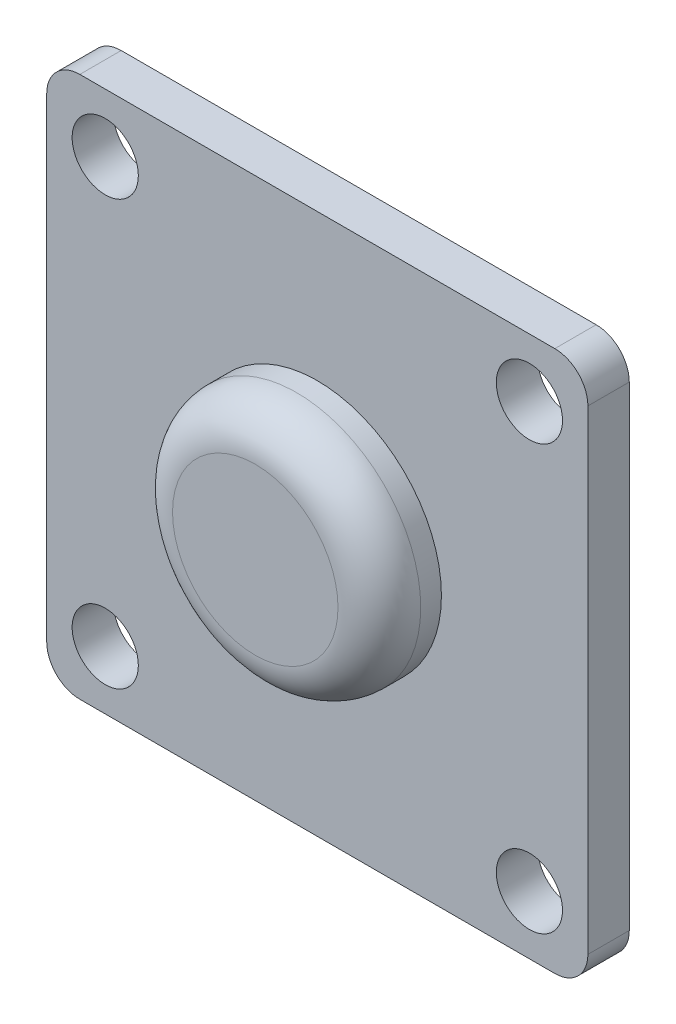
ISO-10303-21;
HEADER;
FILE_DESCRIPTION(('STEP AP214'),'2;1');
FILE_NAME('part.step','',(''),(''),'','','');
FILE_SCHEMA(('AUTOMOTIVE_DESIGN { 1 0 10303 214 1 1 1 1 }'));
ENDSEC;
DATA;
#1=APPLICATION_CONTEXT('core data for automotive mechanical design processes');
#2=APPLICATION_PROTOCOL_DEFINITION('international standard','automotive_design',2000,#1);
#3=PRODUCT_CONTEXT('',#1,'mechanical');
#4=PRODUCT('Part','Part','',(#3));
#5=PRODUCT_RELATED_PRODUCT_CATEGORY('part','',(#4));
#6=PRODUCT_DEFINITION_FORMATION('','',#4);
#7=PRODUCT_DEFINITION_CONTEXT('part definition',#1,'design');
#8=PRODUCT_DEFINITION('design','',#6,#7);
#9=PRODUCT_DEFINITION_SHAPE('','',#8);
#10=(LENGTH_UNIT() NAMED_UNIT(*) SI_UNIT(.MILLI.,.METRE.));
#11=(NAMED_UNIT(*) PLANE_ANGLE_UNIT() SI_UNIT($,.RADIAN.));
#12=(NAMED_UNIT(*) SI_UNIT($,.STERADIAN.) SOLID_ANGLE_UNIT());
#13=UNCERTAINTY_MEASURE_WITH_UNIT(LENGTH_MEASURE(1.E-05),#10,'distance_accuracy_value','');
#14=(GEOMETRIC_REPRESENTATION_CONTEXT(3) GLOBAL_UNCERTAINTY_ASSIGNED_CONTEXT((#13)) GLOBAL_UNIT_ASSIGNED_CONTEXT((#10,
#11,#12)) REPRESENTATION_CONTEXT('',''));
#15=CARTESIAN_POINT('',(0.,0.,0.));
#16=DIRECTION('',(0.,0.,1.));
#17=DIRECTION('',(1.,0.,0.));
#18=AXIS2_PLACEMENT_3D('',#15,#16,#17);
#19=CARTESIAN_POINT('',(0.,0.,2.));
#20=DIRECTION('',(0.,0.,-1.));
#21=DIRECTION('',(-1.,0.,0.));
#22=AXIS2_PLACEMENT_3D('',#19,#20,#21);
#23=PLANE('',#22);
#24=CARTESIAN_POINT('',(0.,0.,2.));
#25=DIRECTION('',(0.,0.,1.));
#26=DIRECTION('',(1.,0.,0.));
#27=AXIS2_PLACEMENT_3D('',#24,#25,#26);
#28=CIRCLE('',#27,6.);
#29=CARTESIAN_POINT('',(6.,0.,2.));
#30=VERTEX_POINT('',#29);
#31=EDGE_CURVE('E156',#30,#30,#28,.T.);
#32=ORIENTED_EDGE('',*,*,#31,.F.);
#33=EDGE_LOOP('',(#32));
#34=FACE_BOUND('',#33,.T.);
#35=DIRECTION('',(-1.,0.,0.));
#36=VECTOR('',#35,1.);
#37=CARTESIAN_POINT('',(-13.0814754519511,13.0814754519512,2.));
#38=LINE('',#37,#36);
#39=CARTESIAN_POINT('',(11.4814754519511,13.0814754519512,2.));
#40=VERTEX_POINT('',#39);
#41=CARTESIAN_POINT('',(-11.4814754519511,13.0814754519512,2.));
#42=VERTEX_POINT('',#41);
#43=EDGE_CURVE('E210',#40,#42,#38,.T.);
#44=ORIENTED_EDGE('',*,*,#43,.T.);
#45=CARTESIAN_POINT('',(-11.4814754519511,11.4814754519511,2.));
#46=DIRECTION('',(0.,0.,-1.));
#47=DIRECTION('',(-1.,0.,0.));
#48=AXIS2_PLACEMENT_3D('',#45,#46,#47);
#49=CIRCLE('',#48,1.6);
#50=CARTESIAN_POINT('',(-13.0814754519511,11.4814754519511,2.));
#51=VERTEX_POINT('',#50);
#52=EDGE_CURVE('E182',#42,#51,#49,.F.);
#53=ORIENTED_EDGE('',*,*,#52,.T.);
#54=DIRECTION('',(0.,-1.,0.));
#55=VECTOR('',#54,1.);
#56=CARTESIAN_POINT('',(-13.0814754519511,-13.0814754519512,2.));
#57=LINE('',#56,#55);
#58=CARTESIAN_POINT('',(-13.0814754519511,-11.4814754519512,2.));
#59=VERTEX_POINT('',#58);
#60=EDGE_CURVE('E131',#51,#59,#57,.T.);
#61=ORIENTED_EDGE('',*,*,#60,.T.);
#62=CARTESIAN_POINT('',(-11.4814754519511,-11.4814754519512,2.));
#63=DIRECTION('',(0.,0.,-1.));
#64=DIRECTION('',(-1.,0.,0.));
#65=AXIS2_PLACEMENT_3D('',#62,#63,#64);
#66=CIRCLE('',#65,1.6);
#67=CARTESIAN_POINT('',(-11.4814754519511,-13.0814754519512,2.));
#68=VERTEX_POINT('',#67);
#69=EDGE_CURVE('E66',#59,#68,#66,.F.);
#70=ORIENTED_EDGE('',*,*,#69,.T.);
#71=DIRECTION('',(1.,0.,0.));
#72=VECTOR('',#71,1.);
#73=CARTESIAN_POINT('',(-13.0814754519511,-13.0814754519512,2.));
#74=LINE('',#73,#72);
#75=CARTESIAN_POINT('',(11.4814754519511,-13.0814754519512,2.));
#76=VERTEX_POINT('',#75);
#77=EDGE_CURVE('E195',#68,#76,#74,.T.);
#78=ORIENTED_EDGE('',*,*,#77,.T.);
#79=CARTESIAN_POINT('',(11.4814754519511,-11.4814754519512,2.));
#80=DIRECTION('',(0.,0.,-1.));
#81=DIRECTION('',(-1.,0.,0.));
#82=AXIS2_PLACEMENT_3D('',#79,#80,#81);
#83=CIRCLE('',#82,1.6);
#84=CARTESIAN_POINT('',(13.0814754519511,-11.4814754519512,2.));
#85=VERTEX_POINT('',#84);
#86=EDGE_CURVE('E176',#76,#85,#83,.F.);
#87=ORIENTED_EDGE('',*,*,#86,.T.);
#88=DIRECTION('',(0.,1.,0.));
#89=VECTOR('',#88,1.);
#90=CARTESIAN_POINT('',(13.0814754519511,-13.0814754519512,2.));
#91=LINE('',#90,#89);
#92=CARTESIAN_POINT('',(13.0814754519511,11.4814754519511,2.));
#93=VERTEX_POINT('',#92);
#94=EDGE_CURVE('E145',#85,#93,#91,.T.);
#95=ORIENTED_EDGE('',*,*,#94,.T.);
#96=CARTESIAN_POINT('',(11.4814754519511,11.4814754519511,2.));
#97=DIRECTION('',(0.,0.,-1.));
#98=DIRECTION('',(-1.,0.,0.));
#99=AXIS2_PLACEMENT_3D('',#96,#97,#98);
#100=CIRCLE('',#99,1.6);
#101=EDGE_CURVE('E179',#93,#40,#100,.F.);
#102=ORIENTED_EDGE('',*,*,#101,.T.);
#103=EDGE_LOOP('',(#44,#53,#61,#70,#78,#87,#95,#102));
#104=FACE_BOUND('',#103,.T.);
#105=CARTESIAN_POINT('',(10.253048327205,10.2530483272049,2.));
#106=DIRECTION('',(0.,0.,1.));
#107=DIRECTION('',(1.,0.,0.));
#108=AXIS2_PLACEMENT_3D('',#105,#106,#107);
#109=CIRCLE('',#108,1.6);
#110=CARTESIAN_POINT('',(11.853048327205,10.2530483272049,2.));
#111=VERTEX_POINT('',#110);
#112=EDGE_CURVE('E223',#111,#111,#109,.T.);
#113=ORIENTED_EDGE('',*,*,#112,.F.);
#114=EDGE_LOOP('',(#113));
#115=FACE_BOUND('',#114,.T.);
#116=CARTESIAN_POINT('',(-10.2530483272049,10.2530483272049,2.));
#117=DIRECTION('',(0.,0.,1.));
#118=DIRECTION('',(1.,0.,0.));
#119=AXIS2_PLACEMENT_3D('',#116,#117,#118);
#120=CIRCLE('',#119,1.6);
#121=CARTESIAN_POINT('',(-8.65304832720488,10.2530483272049,2.));
#122=VERTEX_POINT('',#121);
#123=EDGE_CURVE('E230',#122,#122,#120,.T.);
#124=ORIENTED_EDGE('',*,*,#123,.F.);
#125=EDGE_LOOP('',(#124));
#126=FACE_BOUND('',#125,.T.);
#127=CARTESIAN_POINT('',(-10.2530483272049,-10.253048327205,2.));
#128=DIRECTION('',(0.,0.,1.));
#129=DIRECTION('',(1.,0.,0.));
#130=AXIS2_PLACEMENT_3D('',#127,#128,#129);
#131=CIRCLE('',#130,1.6);
#132=CARTESIAN_POINT('',(-8.65304832720488,-10.253048327205,2.));
#133=VERTEX_POINT('',#132);
#134=EDGE_CURVE('E236',#133,#133,#131,.T.);
#135=ORIENTED_EDGE('',*,*,#134,.F.);
#136=EDGE_LOOP('',(#135));
#137=FACE_BOUND('',#136,.T.);
#138=CARTESIAN_POINT('',(10.253048327205,-10.253048327205,2.));
#139=DIRECTION('',(0.,0.,1.));
#140=DIRECTION('',(1.,0.,0.));
#141=AXIS2_PLACEMENT_3D('',#138,#139,#140);
#142=CIRCLE('',#141,1.6);
#143=CARTESIAN_POINT('',(11.853048327205,-10.253048327205,2.));
#144=VERTEX_POINT('',#143);
#145=EDGE_CURVE('E244',#144,#144,#142,.T.);
#146=ORIENTED_EDGE('',*,*,#145,.F.);
#147=EDGE_LOOP('',(#146));
#148=FACE_BOUND('',#147,.T.);
#149=ADVANCED_FACE('F45',(#34,#104,#115,#126,#137,#148),#23,.F.);
#150=CARTESIAN_POINT('',(0.,0.,0.));
#151=DIRECTION('',(0.,0.,-1.));
#152=DIRECTION('',(-1.,0.,0.));
#153=AXIS2_PLACEMENT_3D('',#150,#151,#152);
#154=PLANE('',#153);
#155=CARTESIAN_POINT('',(0.,0.,0.));
#156=DIRECTION('',(0.,0.,-1.));
#157=DIRECTION('',(-1.,0.,0.));
#158=AXIS2_PLACEMENT_3D('',#155,#156,#157);
#159=CIRCLE('',#158,3.1);
#160=CARTESIAN_POINT('',(-3.1,0.,0.));
#161=VERTEX_POINT('',#160);
#162=EDGE_CURVE('E259',#161,#161,#159,.T.);
#163=ORIENTED_EDGE('',*,*,#162,.F.);
#164=EDGE_LOOP('',(#163));
#165=FACE_BOUND('',#164,.T.);
#166=CARTESIAN_POINT('',(-10.2530483272049,-10.253048327205,0.));
#167=DIRECTION('',(0.,0.,1.));
#168=DIRECTION('',(1.,0.,0.));
#169=AXIS2_PLACEMENT_3D('',#166,#167,#168);
#170=CIRCLE('',#169,1.6);
#171=CARTESIAN_POINT('',(-8.65304832720488,-10.253048327205,0.));
#172=VERTEX_POINT('',#171);
#173=EDGE_CURVE('E240',#172,#172,#170,.T.);
#174=ORIENTED_EDGE('',*,*,#173,.T.);
#175=EDGE_LOOP('',(#174));
#176=FACE_BOUND('',#175,.T.);
#177=CARTESIAN_POINT('',(10.253048327205,10.2530483272049,0.));
#178=DIRECTION('',(0.,0.,1.));
#179=DIRECTION('',(1.,0.,0.));
#180=AXIS2_PLACEMENT_3D('',#177,#178,#179);
#181=CIRCLE('',#180,1.6);
#182=CARTESIAN_POINT('',(11.853048327205,10.2530483272049,0.));
#183=VERTEX_POINT('',#182);
#184=EDGE_CURVE('E216',#183,#183,#181,.T.);
#185=ORIENTED_EDGE('',*,*,#184,.T.);
#186=EDGE_LOOP('',(#185));
#187=FACE_BOUND('',#186,.T.);
#188=DIRECTION('',(0.,-1.,0.));
#189=VECTOR('',#188,1.);
#190=CARTESIAN_POINT('',(-13.0814754519511,-13.0814754519512,0.));
#191=LINE('',#190,#189);
#192=CARTESIAN_POINT('',(-13.0814754519511,11.4814754519511,0.));
#193=VERTEX_POINT('',#192);
#194=CARTESIAN_POINT('',(-13.0814754519511,-11.4814754519512,0.));
#195=VERTEX_POINT('',#194);
#196=EDGE_CURVE('E129',#193,#195,#191,.T.);
#197=ORIENTED_EDGE('',*,*,#196,.F.);
#198=CARTESIAN_POINT('',(-11.4814754519511,11.4814754519511,0.));
#199=DIRECTION('',(0.,0.,-1.));
#200=DIRECTION('',(-1.,0.,0.));
#201=AXIS2_PLACEMENT_3D('',#198,#199,#200);
#202=CIRCLE('',#201,1.6);
#203=CARTESIAN_POINT('',(-11.4814754519511,13.0814754519512,0.));
#204=VERTEX_POINT('',#203);
#205=EDGE_CURVE('E111',#193,#204,#202,.T.);
#206=ORIENTED_EDGE('',*,*,#205,.T.);
#207=DIRECTION('',(-1.,0.,0.));
#208=VECTOR('',#207,1.);
#209=CARTESIAN_POINT('',(-13.0814754519511,13.0814754519512,0.));
#210=LINE('',#209,#208);
#211=CARTESIAN_POINT('',(11.4814754519511,13.0814754519512,0.));
#212=VERTEX_POINT('',#211);
#213=EDGE_CURVE('E141',#212,#204,#210,.T.);
#214=ORIENTED_EDGE('',*,*,#213,.F.);
#215=CARTESIAN_POINT('',(11.4814754519511,11.4814754519511,0.));
#216=DIRECTION('',(0.,0.,-1.));
#217=DIRECTION('',(-1.,0.,0.));
#218=AXIS2_PLACEMENT_3D('',#215,#216,#217);
#219=CIRCLE('',#218,1.6);
#220=CARTESIAN_POINT('',(13.0814754519511,11.4814754519511,0.));
#221=VERTEX_POINT('',#220);
#222=EDGE_CURVE('E123',#212,#221,#219,.T.);
#223=ORIENTED_EDGE('',*,*,#222,.T.);
#224=DIRECTION('',(0.,1.,0.));
#225=VECTOR('',#224,1.);
#226=CARTESIAN_POINT('',(13.0814754519511,-13.0814754519512,0.));
#227=LINE('',#226,#225);
#228=CARTESIAN_POINT('',(13.0814754519511,-11.4814754519512,0.));
#229=VERTEX_POINT('',#228);
#230=EDGE_CURVE('E147',#229,#221,#227,.T.);
#231=ORIENTED_EDGE('',*,*,#230,.F.);
#232=CARTESIAN_POINT('',(11.4814754519511,-11.4814754519512,0.));
#233=DIRECTION('',(0.,0.,-1.));
#234=DIRECTION('',(-1.,0.,0.));
#235=AXIS2_PLACEMENT_3D('',#232,#233,#234);
#236=CIRCLE('',#235,1.6);
#237=CARTESIAN_POINT('',(11.4814754519511,-13.0814754519512,0.));
#238=VERTEX_POINT('',#237);
#239=EDGE_CURVE('E164',#229,#238,#236,.T.);
#240=ORIENTED_EDGE('',*,*,#239,.T.);
#241=DIRECTION('',(1.,0.,0.));
#242=VECTOR('',#241,1.);
#243=CARTESIAN_POINT('',(-13.0814754519511,-13.0814754519512,0.));
#244=LINE('',#243,#242);
#245=CARTESIAN_POINT('',(-11.4814754519511,-13.0814754519512,0.));
#246=VERTEX_POINT('',#245);
#247=EDGE_CURVE('E140',#246,#238,#244,.T.);
#248=ORIENTED_EDGE('',*,*,#247,.F.);
#249=CARTESIAN_POINT('',(-11.4814754519511,-11.4814754519512,0.));
#250=DIRECTION('',(0.,0.,-1.));
#251=DIRECTION('',(-1.,0.,0.));
#252=AXIS2_PLACEMENT_3D('',#249,#250,#251);
#253=CIRCLE('',#252,1.6);
#254=EDGE_CURVE('E133',#246,#195,#253,.T.);
#255=ORIENTED_EDGE('',*,*,#254,.T.);
#256=EDGE_LOOP('',(#197,#206,#214,#223,#231,#240,#248,#255));
#257=FACE_BOUND('',#256,.T.);
#258=CARTESIAN_POINT('',(-10.2530483272049,10.2530483272049,0.));
#259=DIRECTION('',(0.,0.,1.));
#260=DIRECTION('',(1.,0.,0.));
#261=AXIS2_PLACEMENT_3D('',#258,#259,#260);
#262=CIRCLE('',#261,1.6);
#263=CARTESIAN_POINT('',(-8.65304832720488,10.2530483272049,0.));
#264=VERTEX_POINT('',#263);
#265=EDGE_CURVE('E232',#264,#264,#262,.T.);
#266=ORIENTED_EDGE('',*,*,#265,.T.);
#267=EDGE_LOOP('',(#266));
#268=FACE_BOUND('',#267,.T.);
#269=CARTESIAN_POINT('',(10.253048327205,-10.253048327205,0.));
#270=DIRECTION('',(0.,0.,1.));
#271=DIRECTION('',(1.,0.,0.));
#272=AXIS2_PLACEMENT_3D('',#269,#270,#271);
#273=CIRCLE('',#272,1.6);
#274=CARTESIAN_POINT('',(11.853048327205,-10.253048327205,0.));
#275=VERTEX_POINT('',#274);
#276=EDGE_CURVE('E248',#275,#275,#273,.T.);
#277=ORIENTED_EDGE('',*,*,#276,.T.);
#278=EDGE_LOOP('',(#277));
#279=FACE_BOUND('',#278,.T.);
#280=ADVANCED_FACE('F136',(#165,#176,#187,#257,#268,#279),#154,.T.);
#281=CARTESIAN_POINT('',(13.0814754519511,-13.0814754519512,2.));
#282=DIRECTION('',(-1.,0.,0.));
#283=DIRECTION('',(0.,0.,1.));
#284=AXIS2_PLACEMENT_3D('',#281,#282,#283);
#285=PLANE('',#284);
#286=ORIENTED_EDGE('',*,*,#230,.T.);
#287=DIRECTION('',(0.,0.,-1.));
#288=VECTOR('',#287,1.);
#289=CARTESIAN_POINT('',(13.0814754519511,11.4814754519511,2.));
#290=LINE('',#289,#288);
#291=EDGE_CURVE('E189',#221,#93,#290,.F.);
#292=ORIENTED_EDGE('',*,*,#291,.T.);
#293=ORIENTED_EDGE('',*,*,#94,.F.);
#294=DIRECTION('',(0.,0.,-1.));
#295=VECTOR('',#294,1.);
#296=CARTESIAN_POINT('',(13.0814754519511,-11.4814754519512,2.));
#297=LINE('',#296,#295);
#298=EDGE_CURVE('E185',#85,#229,#297,.T.);
#299=ORIENTED_EDGE('',*,*,#298,.T.);
#300=EDGE_LOOP('',(#286,#292,#293,#299));
#301=FACE_BOUND('',#300,.T.);
#302=ADVANCED_FACE('F205',(#301),#285,.F.);
#303=CARTESIAN_POINT('',(-13.0814754519511,13.0814754519512,2.));
#304=DIRECTION('',(0.,-1.,0.));
#305=DIRECTION('',(0.,0.,-1.));
#306=AXIS2_PLACEMENT_3D('',#303,#304,#305);
#307=PLANE('',#306);
#308=ORIENTED_EDGE('',*,*,#213,.T.);
#309=DIRECTION('',(0.,0.,-1.));
#310=VECTOR('',#309,1.);
#311=CARTESIAN_POINT('',(-11.4814754519511,13.0814754519512,2.));
#312=LINE('',#311,#310);
#313=EDGE_CURVE('E116',#204,#42,#312,.F.);
#314=ORIENTED_EDGE('',*,*,#313,.T.);
#315=ORIENTED_EDGE('',*,*,#43,.F.);
#316=DIRECTION('',(0.,0.,-1.));
#317=VECTOR('',#316,1.);
#318=CARTESIAN_POINT('',(11.4814754519511,13.0814754519512,2.));
#319=LINE('',#318,#317);
#320=EDGE_CURVE('E122',#40,#212,#319,.T.);
#321=ORIENTED_EDGE('',*,*,#320,.T.);
#322=EDGE_LOOP('',(#308,#314,#315,#321));
#323=FACE_BOUND('',#322,.T.);
#324=ADVANCED_FACE('F305',(#323),#307,.F.);
#325=CARTESIAN_POINT('',(-13.0814754519511,-13.0814754519512,2.));
#326=DIRECTION('',(1.,0.,0.));
#327=DIRECTION('',(0.,0.,-1.));
#328=AXIS2_PLACEMENT_3D('',#325,#326,#327);
#329=PLANE('',#328);
#330=ORIENTED_EDGE('',*,*,#60,.F.);
#331=DIRECTION('',(0.,0.,-1.));
#332=VECTOR('',#331,1.);
#333=CARTESIAN_POINT('',(-13.0814754519511,11.4814754519511,2.));
#334=LINE('',#333,#332);
#335=EDGE_CURVE('E115',#51,#193,#334,.T.);
#336=ORIENTED_EDGE('',*,*,#335,.T.);
#337=ORIENTED_EDGE('',*,*,#196,.T.);
#338=DIRECTION('',(0.,0.,-1.));
#339=VECTOR('',#338,1.);
#340=CARTESIAN_POINT('',(-13.0814754519511,-11.4814754519512,2.));
#341=LINE('',#340,#339);
#342=EDGE_CURVE('E134',#195,#59,#341,.F.);
#343=ORIENTED_EDGE('',*,*,#342,.T.);
#344=EDGE_LOOP('',(#330,#336,#337,#343));
#345=FACE_BOUND('',#344,.T.);
#346=ADVANCED_FACE('F128',(#345),#329,.F.);
#347=CARTESIAN_POINT('',(-13.0814754519511,-13.0814754519512,2.));
#348=DIRECTION('',(0.,1.,0.));
#349=DIRECTION('',(0.,0.,1.));
#350=AXIS2_PLACEMENT_3D('',#347,#348,#349);
#351=PLANE('',#350);
#352=ORIENTED_EDGE('',*,*,#247,.T.);
#353=DIRECTION('',(0.,0.,-1.));
#354=VECTOR('',#353,1.);
#355=CARTESIAN_POINT('',(11.4814754519511,-13.0814754519512,2.));
#356=LINE('',#355,#354);
#357=EDGE_CURVE('E11',#238,#76,#356,.F.);
#358=ORIENTED_EDGE('',*,*,#357,.T.);
#359=ORIENTED_EDGE('',*,*,#77,.F.);
#360=DIRECTION('',(0.,0.,-1.));
#361=VECTOR('',#360,1.);
#362=CARTESIAN_POINT('',(-11.4814754519511,-13.0814754519512,2.));
#363=LINE('',#362,#361);
#364=EDGE_CURVE('E54',#68,#246,#363,.T.);
#365=ORIENTED_EDGE('',*,*,#364,.T.);
#366=EDGE_LOOP('',(#352,#358,#359,#365));
#367=FACE_BOUND('',#366,.T.);
#368=ADVANCED_FACE('F194',(#367),#351,.F.);
#369=CARTESIAN_POINT('',(10.253048327205,10.2530483272049,2.));
#370=DIRECTION('',(0.,0.,-1.));
#371=DIRECTION('',(-1.,0.,0.));
#372=AXIS2_PLACEMENT_3D('',#369,#370,#371);
#373=CYLINDRICAL_SURFACE('',#372,1.6);
#374=ORIENTED_EDGE('',*,*,#112,.T.);
#375=EDGE_LOOP('',(#374));
#376=FACE_BOUND('',#375,.T.);
#377=ORIENTED_EDGE('',*,*,#184,.F.);
#378=EDGE_LOOP('',(#377));
#379=FACE_BOUND('',#378,.T.);
#380=ADVANCED_FACE('F283',(#376,#379),#373,.F.);
#381=CARTESIAN_POINT('',(-10.2530483272049,10.2530483272049,2.));
#382=DIRECTION('',(0.,0.,-1.));
#383=DIRECTION('',(-1.,0.,0.));
#384=AXIS2_PLACEMENT_3D('',#381,#382,#383);
#385=CYLINDRICAL_SURFACE('',#384,1.6);
#386=ORIENTED_EDGE('',*,*,#123,.T.);
#387=EDGE_LOOP('',(#386));
#388=FACE_BOUND('',#387,.T.);
#389=ORIENTED_EDGE('',*,*,#265,.F.);
#390=EDGE_LOOP('',(#389));
#391=FACE_BOUND('',#390,.T.);
#392=ADVANCED_FACE('F285',(#388,#391),#385,.F.);
#393=CARTESIAN_POINT('',(-10.2530483272049,-10.253048327205,2.));
#394=DIRECTION('',(0.,0.,-1.));
#395=DIRECTION('',(-1.,0.,0.));
#396=AXIS2_PLACEMENT_3D('',#393,#394,#395);
#397=CYLINDRICAL_SURFACE('',#396,1.6);
#398=ORIENTED_EDGE('',*,*,#134,.T.);
#399=EDGE_LOOP('',(#398));
#400=FACE_BOUND('',#399,.T.);
#401=ORIENTED_EDGE('',*,*,#173,.F.);
#402=EDGE_LOOP('',(#401));
#403=FACE_BOUND('',#402,.T.);
#404=ADVANCED_FACE('F290',(#400,#403),#397,.F.);
#405=CARTESIAN_POINT('',(10.253048327205,-10.253048327205,2.));
#406=DIRECTION('',(0.,0.,-1.));
#407=DIRECTION('',(-1.,0.,0.));
#408=AXIS2_PLACEMENT_3D('',#405,#406,#407);
#409=CYLINDRICAL_SURFACE('',#408,1.6);
#410=ORIENTED_EDGE('',*,*,#145,.T.);
#411=EDGE_LOOP('',(#410));
#412=FACE_BOUND('',#411,.T.);
#413=ORIENTED_EDGE('',*,*,#276,.F.);
#414=EDGE_LOOP('',(#413));
#415=FACE_BOUND('',#414,.T.);
#416=ADVANCED_FACE('F335',(#412,#415),#409,.F.);
#417=CARTESIAN_POINT('',(0.,0.,5.));
#418=DIRECTION('',(0.,0.,-1.));
#419=DIRECTION('',(-1.,0.,0.));
#420=AXIS2_PLACEMENT_3D('',#417,#418,#419);
#421=CYLINDRICAL_SURFACE('',#420,6.);
#422=CARTESIAN_POINT('',(0.,0.,3.));
#423=DIRECTION('',(0.,0.,1.));
#424=DIRECTION('',(1.,0.,0.));
#425=AXIS2_PLACEMENT_3D('',#422,#423,#424);
#426=CIRCLE('',#425,6.);
#427=CARTESIAN_POINT('',(6.,0.,3.));
#428=VERTEX_POINT('',#427);
#429=EDGE_CURVE('E155',#428,#428,#426,.F.);
#430=ORIENTED_EDGE('',*,*,#429,.T.);
#431=EDGE_LOOP('',(#430));
#432=FACE_BOUND('',#431,.T.);
#433=ORIENTED_EDGE('',*,*,#31,.T.);
#434=EDGE_LOOP('',(#433));
#435=FACE_BOUND('',#434,.T.);
#436=ADVANCED_FACE('F338',(#432,#435),#421,.T.);
#437=CARTESIAN_POINT('',(0.,0.,5.));
#438=DIRECTION('',(0.,0.,1.));
#439=DIRECTION('',(1.,0.,0.));
#440=AXIS2_PLACEMENT_3D('',#437,#438,#439);
#441=PLANE('',#440);
#442=CARTESIAN_POINT('',(0.,0.,5.));
#443=DIRECTION('',(0.,0.,1.));
#444=DIRECTION('',(1.,0.,0.));
#445=AXIS2_PLACEMENT_3D('',#442,#443,#444);
#446=CIRCLE('',#445,4.);
#447=CARTESIAN_POINT('',(4.,0.,5.));
#448=VERTEX_POINT('',#447);
#449=EDGE_CURVE('E151',#448,#448,#446,.T.);
#450=ORIENTED_EDGE('',*,*,#449,.T.);
#451=EDGE_LOOP('',(#450));
#452=FACE_BOUND('',#451,.T.);
#453=ADVANCED_FACE('F272',(#452),#441,.T.);
#454=CARTESIAN_POINT('',(0.,0.,3.));
#455=DIRECTION('',(0.,0.,-1.));
#456=DIRECTION('',(-1.,0.,0.));
#457=AXIS2_PLACEMENT_3D('',#454,#455,#456);
#458=CYLINDRICAL_SURFACE('',#457,3.1);
#459=CARTESIAN_POINT('',(0.,0.,3.));
#460=DIRECTION('',(0.,0.,-1.));
#461=DIRECTION('',(-1.,0.,0.));
#462=AXIS2_PLACEMENT_3D('',#459,#460,#461);
#463=CIRCLE('',#462,3.1);
#464=CARTESIAN_POINT('',(-3.1,0.,3.));
#465=VERTEX_POINT('',#464);
#466=EDGE_CURVE('E252',#465,#465,#463,.T.);
#467=ORIENTED_EDGE('',*,*,#466,.F.);
#468=EDGE_LOOP('',(#467));
#469=FACE_BOUND('',#468,.T.);
#470=ORIENTED_EDGE('',*,*,#162,.T.);
#471=EDGE_LOOP('',(#470));
#472=FACE_BOUND('',#471,.T.);
#473=ADVANCED_FACE('F269',(#469,#472),#458,.F.);
#474=CARTESIAN_POINT('',(0.,0.,3.));
#475=DIRECTION('',(0.,0.,-1.));
#476=DIRECTION('',(-1.,0.,0.));
#477=AXIS2_PLACEMENT_3D('',#474,#475,#476);
#478=PLANE('',#477);
#479=ORIENTED_EDGE('',*,*,#466,.T.);
#480=EDGE_LOOP('',(#479));
#481=FACE_BOUND('',#480,.T.);
#482=ADVANCED_FACE('F267',(#481),#478,.T.);
#483=CARTESIAN_POINT('',(0.,0.,3.));
#484=DIRECTION('',(0.,0.,1.));
#485=DIRECTION('',(1.,0.,0.));
#486=AXIS2_PLACEMENT_3D('',#483,#484,#485);
#487=TOROIDAL_SURFACE('',#486,4.,2.);
#488=ORIENTED_EDGE('',*,*,#429,.F.);
#489=EDGE_LOOP('',(#488));
#490=FACE_BOUND('',#489,.T.);
#491=ORIENTED_EDGE('',*,*,#449,.F.);
#492=EDGE_LOOP('',(#491));
#493=FACE_BOUND('',#492,.T.);
#494=ADVANCED_FACE('F311',(#490,#493),#487,.T.);
#495=CARTESIAN_POINT('',(-11.4814754519511,11.4814754519511,2.));
#496=DIRECTION('',(0.,0.,-1.));
#497=DIRECTION('',(-1.,0.,0.));
#498=AXIS2_PLACEMENT_3D('',#495,#496,#497);
#499=CYLINDRICAL_SURFACE('',#498,1.6);
#500=ORIENTED_EDGE('',*,*,#52,.F.);
#501=ORIENTED_EDGE('',*,*,#313,.F.);
#502=ORIENTED_EDGE('',*,*,#205,.F.);
#503=ORIENTED_EDGE('',*,*,#335,.F.);
#504=EDGE_LOOP('',(#500,#501,#502,#503));
#505=FACE_BOUND('',#504,.T.);
#506=ADVANCED_FACE('F114',(#505),#499,.T.);
#507=CARTESIAN_POINT('',(11.4814754519511,11.4814754519511,2.));
#508=DIRECTION('',(0.,0.,-1.));
#509=DIRECTION('',(-1.,0.,0.));
#510=AXIS2_PLACEMENT_3D('',#507,#508,#509);
#511=CYLINDRICAL_SURFACE('',#510,1.6);
#512=ORIENTED_EDGE('',*,*,#101,.F.);
#513=ORIENTED_EDGE('',*,*,#291,.F.);
#514=ORIENTED_EDGE('',*,*,#222,.F.);
#515=ORIENTED_EDGE('',*,*,#320,.F.);
#516=EDGE_LOOP('',(#512,#513,#514,#515));
#517=FACE_BOUND('',#516,.T.);
#518=ADVANCED_FACE('F316',(#517),#511,.T.);
#519=CARTESIAN_POINT('',(11.4814754519511,-11.4814754519512,2.));
#520=DIRECTION('',(0.,0.,-1.));
#521=DIRECTION('',(-1.,0.,0.));
#522=AXIS2_PLACEMENT_3D('',#519,#520,#521);
#523=CYLINDRICAL_SURFACE('',#522,1.6);
#524=ORIENTED_EDGE('',*,*,#86,.F.);
#525=ORIENTED_EDGE('',*,*,#357,.F.);
#526=ORIENTED_EDGE('',*,*,#239,.F.);
#527=ORIENTED_EDGE('',*,*,#298,.F.);
#528=EDGE_LOOP('',(#524,#525,#526,#527));
#529=FACE_BOUND('',#528,.T.);
#530=ADVANCED_FACE('F202',(#529),#523,.T.);
#531=CARTESIAN_POINT('',(-11.4814754519511,-11.4814754519512,2.));
#532=DIRECTION('',(0.,0.,-1.));
#533=DIRECTION('',(-1.,0.,0.));
#534=AXIS2_PLACEMENT_3D('',#531,#532,#533);
#535=CYLINDRICAL_SURFACE('',#534,1.6);
#536=ORIENTED_EDGE('',*,*,#69,.F.);
#537=ORIENTED_EDGE('',*,*,#342,.F.);
#538=ORIENTED_EDGE('',*,*,#254,.F.);
#539=ORIENTED_EDGE('',*,*,#364,.F.);
#540=EDGE_LOOP('',(#536,#537,#538,#539));
#541=FACE_BOUND('',#540,.T.);
#542=ADVANCED_FACE('F47',(#541),#535,.T.);
#543=CLOSED_SHELL('',(#149,#280,#302,#324,#346,#368,#380,#392,#404,#416,#436,#453,#473,#482,
#494,#506,#518,#530,#542));
#544=MANIFOLD_SOLID_BREP('B2',#543);
#545=ADVANCED_BREP_SHAPE_REPRESENTATION('',(#18,#544),#14);
#546=SHAPE_DEFINITION_REPRESENTATION(#9,#545);
ENDSEC;
END-ISO-10303-21;
